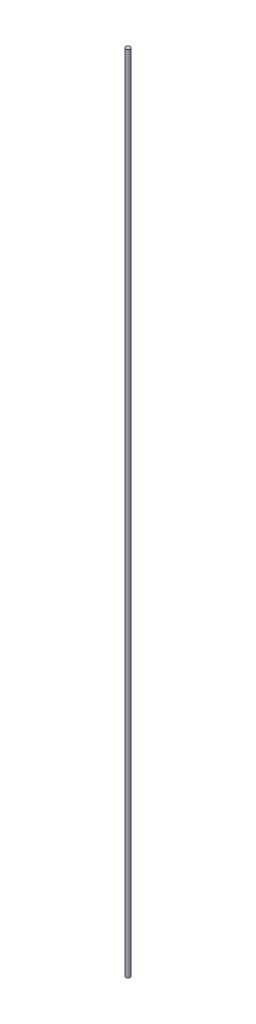
ISO-10303-21;
HEADER;
FILE_DESCRIPTION(('STEP AP214'),'2;1');
FILE_NAME('part.step','',(''),(''),'','','');
FILE_SCHEMA(('AUTOMOTIVE_DESIGN { 1 0 10303 214 1 1 1 1 }'));
ENDSEC;
DATA;
#1=APPLICATION_CONTEXT('core data for automotive mechanical design processes');
#2=APPLICATION_PROTOCOL_DEFINITION('international standard','automotive_design',2000,#1);
#3=PRODUCT_CONTEXT('',#1,'mechanical');
#4=PRODUCT('Part','Part','',(#3));
#5=PRODUCT_RELATED_PRODUCT_CATEGORY('part','',(#4));
#6=PRODUCT_DEFINITION_FORMATION('','',#4);
#7=PRODUCT_DEFINITION_CONTEXT('part definition',#1,'design');
#8=PRODUCT_DEFINITION('design','',#6,#7);
#9=PRODUCT_DEFINITION_SHAPE('','',#8);
#10=(LENGTH_UNIT() NAMED_UNIT(*) SI_UNIT(.MILLI.,.METRE.));
#11=(NAMED_UNIT(*) PLANE_ANGLE_UNIT() SI_UNIT($,.RADIAN.));
#12=(NAMED_UNIT(*) SI_UNIT($,.STERADIAN.) SOLID_ANGLE_UNIT());
#13=UNCERTAINTY_MEASURE_WITH_UNIT(LENGTH_MEASURE(1.E-05),#10,'distance_accuracy_value','');
#14=(GEOMETRIC_REPRESENTATION_CONTEXT(3) GLOBAL_UNCERTAINTY_ASSIGNED_CONTEXT((#13)) GLOBAL_UNIT_ASSIGNED_CONTEXT((#10,
#11,#12)) REPRESENTATION_CONTEXT('',''));
#15=CARTESIAN_POINT('',(0.,0.,0.));
#16=DIRECTION('',(0.,0.,1.));
#17=DIRECTION('',(1.,0.,0.));
#18=AXIS2_PLACEMENT_3D('',#15,#16,#17);
#19=CARTESIAN_POINT('',(0.,1500.,0.));
#20=DIRECTION('',(0.,-1.,0.));
#21=DIRECTION('',(0.,0.,-1.));
#22=AXIS2_PLACEMENT_3D('',#19,#20,#21);
#23=CYLINDRICAL_SURFACE('',#22,4.);
#24=CARTESIAN_POINT('',(0.,1500.,0.));
#25=DIRECTION('',(0.,1.,0.));
#26=DIRECTION('',(0.,0.,1.));
#27=AXIS2_PLACEMENT_3D('',#24,#25,#26);
#28=CIRCLE('',#27,4.);
#29=CARTESIAN_POINT('',(0.,1500.,4.));
#30=VERTEX_POINT('',#29);
#31=EDGE_CURVE('E10',#30,#30,#28,.T.);
#32=ORIENTED_EDGE('',*,*,#31,.F.);
#33=EDGE_LOOP('',(#32));
#34=FACE_BOUND('',#33,.T.);
#35=CARTESIAN_POINT('',(0.,0.,0.));
#36=DIRECTION('',(0.,1.,0.));
#37=DIRECTION('',(0.,0.,1.));
#38=AXIS2_PLACEMENT_3D('',#35,#36,#37);
#39=CIRCLE('',#38,4.);
#40=CARTESIAN_POINT('',(0.,0.,4.));
#41=VERTEX_POINT('',#40);
#42=EDGE_CURVE('E44',#41,#41,#39,.T.);
#43=ORIENTED_EDGE('',*,*,#42,.T.);
#44=EDGE_LOOP('',(#43));
#45=FACE_BOUND('',#44,.T.);
#46=ADVANCED_FACE('F41',(#34,#45),#23,.T.);
#47=CARTESIAN_POINT('',(0.,1500.,0.));
#48=DIRECTION('',(0.,1.,0.));
#49=DIRECTION('',(0.,0.,1.));
#50=AXIS2_PLACEMENT_3D('',#47,#48,#49);
#51=PLANE('',#50);
#52=ORIENTED_EDGE('',*,*,#31,.T.);
#53=EDGE_LOOP('',(#52));
#54=FACE_BOUND('',#53,.T.);
#55=ADVANCED_FACE('F56',(#54),#51,.T.);
#56=CARTESIAN_POINT('',(0.,0.,0.));
#57=DIRECTION('',(0.,1.,0.));
#58=DIRECTION('',(0.,0.,1.));
#59=AXIS2_PLACEMENT_3D('',#56,#57,#58);
#60=PLANE('',#59);
#61=ORIENTED_EDGE('',*,*,#42,.F.);
#62=EDGE_LOOP('',(#61));
#63=FACE_BOUND('',#62,.T.);
#64=ADVANCED_FACE('F54',(#63),#60,.F.);
#65=CLOSED_SHELL('',(#46,#55,#64));
#66=MANIFOLD_SOLID_BREP('B2',#65);
#67=ADVANCED_BREP_SHAPE_REPRESENTATION('',(#18,#66),#14);
#68=SHAPE_DEFINITION_REPRESENTATION(#9,#67);
ENDSEC;
END-ISO-10303-21;
